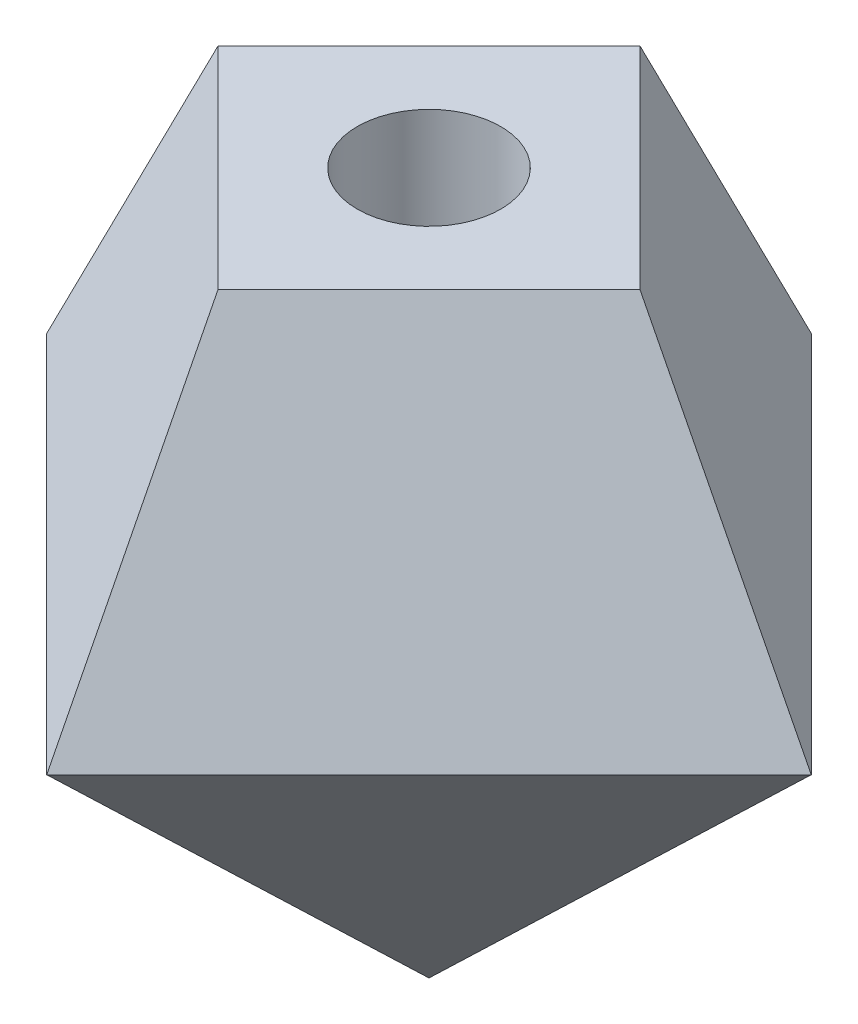
ISO-10303-21;
HEADER;
FILE_DESCRIPTION(('STEP AP214'),'2;1');
FILE_NAME('part.step','',(''),(''),'','','');
FILE_SCHEMA(('AUTOMOTIVE_DESIGN { 1 0 10303 214 1 1 1 1 }'));
ENDSEC;
DATA;
#1=APPLICATION_CONTEXT('core data for automotive mechanical design processes');
#2=APPLICATION_PROTOCOL_DEFINITION('international standard','automotive_design',2000,#1);
#3=PRODUCT_CONTEXT('',#1,'mechanical');
#4=PRODUCT('Part','Part','',(#3));
#5=PRODUCT_RELATED_PRODUCT_CATEGORY('part','',(#4));
#6=PRODUCT_DEFINITION_FORMATION('','',#4);
#7=PRODUCT_DEFINITION_CONTEXT('part definition',#1,'design');
#8=PRODUCT_DEFINITION('design','',#6,#7);
#9=PRODUCT_DEFINITION_SHAPE('','',#8);
#10=(LENGTH_UNIT() NAMED_UNIT(*) SI_UNIT(.MILLI.,.METRE.));
#11=(NAMED_UNIT(*) PLANE_ANGLE_UNIT() SI_UNIT($,.RADIAN.));
#12=(NAMED_UNIT(*) SI_UNIT($,.STERADIAN.) SOLID_ANGLE_UNIT());
#13=UNCERTAINTY_MEASURE_WITH_UNIT(LENGTH_MEASURE(1.E-05),#10,'distance_accuracy_value','');
#14=(GEOMETRIC_REPRESENTATION_CONTEXT(3) GLOBAL_UNCERTAINTY_ASSIGNED_CONTEXT((#13)) GLOBAL_UNIT_ASSIGNED_CONTEXT((#10,
#11,#12)) REPRESENTATION_CONTEXT('',''));
#15=CARTESIAN_POINT('',(0.,0.,0.));
#16=DIRECTION('',(0.,0.,1.));
#17=DIRECTION('',(1.,0.,0.));
#18=AXIS2_PLACEMENT_3D('',#15,#16,#17);
#19=CARTESIAN_POINT('',(90.2756165830993,49.5184628230477,25.4));
#20=DIRECTION('',(0.,-1.,0.));
#21=DIRECTION('',(0.,0.,-1.));
#22=AXIS2_PLACEMENT_3D('',#19,#20,#21);
#23=PLANE('',#22);
#24=CARTESIAN_POINT('',(90.2756165830993,49.5184628230477,0.));
#25=DIRECTION('',(0.,1.,0.));
#26=DIRECTION('',(0.,0.,1.));
#27=AXIS2_PLACEMENT_3D('',#24,#25,#26);
#28=CIRCLE('',#27,4.7625);
#29=CARTESIAN_POINT('',(90.2756165830993,49.5184628230477,4.7625));
#30=VERTEX_POINT('',#29);
#31=EDGE_CURVE('E149',#30,#30,#28,.T.);
#32=ORIENTED_EDGE('',*,*,#31,.F.);
#33=EDGE_LOOP('',(#32));
#34=FACE_BOUND('',#33,.T.);
#35=DIRECTION('',(-0.707106781186545,0.,0.70710678118655));
#36=VECTOR('',#35,1.);
#37=CARTESIAN_POINT('',(84.5865105530895,49.5184628230477,19.7108939699902));
#38=LINE('',#37,#36);
#39=CARTESIAN_POINT('',(104.29740452308,49.5184628230476,0.));
#40=VERTEX_POINT('',#39);
#41=CARTESIAN_POINT('',(90.2756165830994,49.5184628230477,14.0217879399803));
#42=VERTEX_POINT('',#41);
#43=EDGE_CURVE('E47',#40,#42,#38,.T.);
#44=ORIENTED_EDGE('',*,*,#43,.F.);
#45=DIRECTION('',(0.707106781186548,0.,0.707106781186547));
#46=VECTOR('',#45,1.);
#47=CARTESIAN_POINT('',(109.986510553089,49.5184628230477,5.68910603000988));
#48=LINE('',#47,#46);
#49=CARTESIAN_POINT('',(90.2756165830993,49.5184628230477,-14.0217879399803));
#50=VERTEX_POINT('',#49);
#51=EDGE_CURVE('E55',#50,#40,#48,.T.);
#52=ORIENTED_EDGE('',*,*,#51,.F.);
#53=DIRECTION('',(0.70710678118654,0.,-0.707106781186555));
#54=VECTOR('',#53,1.);
#55=CARTESIAN_POINT('',(70.5647226131092,49.5184628230477,5.68910603001023));
#56=LINE('',#55,#54);
#57=CARTESIAN_POINT('',(76.2538286431193,49.5184628230477,0.));
#58=VERTEX_POINT('',#57);
#59=EDGE_CURVE('E115',#58,#50,#56,.T.);
#60=ORIENTED_EDGE('',*,*,#59,.F.);
#61=DIRECTION('',(-0.707106781186548,0.,-0.707106781186547));
#62=VECTOR('',#61,1.);
#63=CARTESIAN_POINT('',(95.9647226131092,49.5184628230477,19.7108939699901));
#64=LINE('',#63,#62);
#65=EDGE_CURVE('E129',#42,#58,#64,.T.);
#66=ORIENTED_EDGE('',*,*,#65,.F.);
#67=EDGE_LOOP('',(#44,#52,#60,#66));
#68=FACE_BOUND('',#67,.T.);
#69=ADVANCED_FACE('F33',(#34,#68),#23,.F.);
#70=CARTESIAN_POINT('',(22.5023699159939,-11.5202131274325,-22.5023699159939));
#71=DIRECTION('',(-0.664881494830121,0.340389770211925,0.664881494830121));
#72=DIRECTION('',(0.707106781186548,0.,0.707106781186547));
#73=AXIS2_PLACEMENT_3D('',#70,#71,#72);
#74=PLANE('',#73);
#75=DIRECTION('',(0.707106781186548,0.,0.707106781186547));
#76=VECTOR('',#75,1.);
#77=CARTESIAN_POINT('',(77.5756165830994,27.2934628230477,12.7));
#78=LINE('',#77,#76);
#79=CARTESIAN_POINT('',(64.8756165830994,27.2934628230477,0.));
#80=VERTEX_POINT('',#79);
#81=CARTESIAN_POINT('',(90.2756165830994,27.2934628230477,25.4));
#82=VERTEX_POINT('',#81);
#83=EDGE_CURVE('E40',#80,#82,#78,.T.);
#84=ORIENTED_EDGE('',*,*,#83,.T.);
#85=DIRECTION('',(0.,0.890129875554102,-0.455706928459552));
#86=VECTOR('',#85,1.);
#87=CARTESIAN_POINT('',(90.2756165830993,27.2934628230477,25.4));
#88=LINE('',#87,#86);
#89=EDGE_CURVE('E132',#82,#42,#88,.T.);
#90=ORIENTED_EDGE('',*,*,#89,.T.);
#91=ORIENTED_EDGE('',*,*,#65,.T.);
#92=DIRECTION('',(-0.455706928459552,-0.890129875554102,0.));
#93=VECTOR('',#92,1.);
#94=CARTESIAN_POINT('',(76.2538286431191,49.5184628230477,0.));
#95=LINE('',#94,#93);
#96=EDGE_CURVE('E11',#58,#80,#95,.T.);
#97=ORIENTED_EDGE('',*,*,#96,.T.);
#98=EDGE_LOOP('',(#84,#90,#91,#97));
#99=FACE_BOUND('',#98,.T.);
#100=ADVANCED_FACE('F134',(#99),#74,.T.);
#101=CARTESIAN_POINT('',(67.7732466671056,-11.5202131274325,67.7732466671055));
#102=DIRECTION('',(0.664881494830124,0.340389770211925,0.664881494830119));
#103=DIRECTION('',(0.707106781186545,0.,-0.70710678118655));
#104=AXIS2_PLACEMENT_3D('',#101,#102,#103);
#105=PLANE('',#104);
#106=DIRECTION('',(0.707106781186545,0.,-0.70710678118655));
#107=VECTOR('',#106,1.);
#108=CARTESIAN_POINT('',(77.5756165830995,27.2934628230477,38.1));
#109=LINE('',#108,#107);
#110=CARTESIAN_POINT('',(115.675616583099,27.2934628230476,0.));
#111=VERTEX_POINT('',#110);
#112=EDGE_CURVE('E84',#82,#111,#109,.T.);
#113=ORIENTED_EDGE('',*,*,#112,.T.);
#114=DIRECTION('',(-0.455706928459552,0.890129875554102,0.));
#115=VECTOR('',#114,1.);
#116=CARTESIAN_POINT('',(121.472104211872,15.9712149276919,0.));
#117=LINE('',#116,#115);
#118=EDGE_CURVE('E108',#111,#40,#117,.T.);
#119=ORIENTED_EDGE('',*,*,#118,.T.);
#120=ORIENTED_EDGE('',*,*,#43,.T.);
#121=ORIENTED_EDGE('',*,*,#89,.F.);
#122=EDGE_LOOP('',(#113,#119,#120,#121));
#123=FACE_BOUND('',#122,.T.);
#124=ADVANCED_FACE('F146',(#123),#105,.T.);
#125=CARTESIAN_POINT('',(158.048863250205,-11.5202131274325,22.5023699159939));
#126=DIRECTION('',(0.664881494830121,0.340389770211925,-0.664881494830121));
#127=DIRECTION('',(-0.707106781186548,0.,-0.707106781186547));
#128=AXIS2_PLACEMENT_3D('',#125,#126,#127);
#129=PLANE('',#128);
#130=DIRECTION('',(-0.707106781186548,0.,-0.707106781186547));
#131=VECTOR('',#130,1.);
#132=CARTESIAN_POINT('',(102.975616583099,27.2934628230477,-12.7));
#133=LINE('',#132,#131);
#134=CARTESIAN_POINT('',(90.2756165830994,27.2934628230477,-25.4));
#135=VERTEX_POINT('',#134);
#136=EDGE_CURVE('E96',#111,#135,#133,.T.);
#137=ORIENTED_EDGE('',*,*,#136,.T.);
#138=DIRECTION('',(0.,0.890129875554101,0.455706928459554));
#139=VECTOR('',#138,1.);
#140=CARTESIAN_POINT('',(90.2756165830992,15.9712149276924,-31.1964876287725));
#141=LINE('',#140,#139);
#142=EDGE_CURVE('E106',#135,#50,#141,.T.);
#143=ORIENTED_EDGE('',*,*,#142,.T.);
#144=ORIENTED_EDGE('',*,*,#51,.T.);
#145=ORIENTED_EDGE('',*,*,#118,.F.);
#146=EDGE_LOOP('',(#137,#143,#144,#145));
#147=FACE_BOUND('',#146,.T.);
#148=ADVANCED_FACE('F176',(#147),#129,.T.);
#149=CARTESIAN_POINT('',(112.777986499093,-11.5202131274325,-67.7732466671057));
#150=DIRECTION('',(-0.664881494830128,0.340389770211925,-0.664881494830114));
#151=DIRECTION('',(-0.70710678118654,0.,0.707106781186555));
#152=AXIS2_PLACEMENT_3D('',#149,#150,#151);
#153=PLANE('',#152);
#154=DIRECTION('',(-0.70710678118654,0.,0.707106781186555));
#155=VECTOR('',#154,1.);
#156=CARTESIAN_POINT('',(52.1756165830995,27.2934628230477,12.7000000000004));
#157=LINE('',#156,#155);
#158=EDGE_CURVE('E102',#135,#80,#157,.T.);
#159=ORIENTED_EDGE('',*,*,#158,.T.);
#160=ORIENTED_EDGE('',*,*,#96,.F.);
#161=ORIENTED_EDGE('',*,*,#59,.T.);
#162=ORIENTED_EDGE('',*,*,#142,.F.);
#163=EDGE_LOOP('',(#159,#160,#161,#162));
#164=FACE_BOUND('',#163,.T.);
#165=ADVANCED_FACE('F138',(#164),#153,.T.);
#166=CARTESIAN_POINT('',(30.2501654762339,31.4957199697212,-30.250165476234));
#167=DIRECTION('',(-0.569429025934608,-0.592875340055837,0.56942902593461));
#168=DIRECTION('',(0.,-0.692701911407947,-0.721224002603752));
#169=AXIS2_PLACEMENT_3D('',#166,#167,#168);
#170=PLANE('',#169);
#171=DIRECTION('',(0.,0.692701911407947,0.721224002603752));
#172=VECTOR('',#171,1.);
#173=CARTESIAN_POINT('',(90.2756165830994,15.5876196111499,13.2121671730671));
#174=LINE('',#173,#172);
#175=CARTESIAN_POINT('',(90.2756165830994,2.89795118416439,0.));
#176=VERTEX_POINT('',#175);
#177=EDGE_CURVE('E79',#176,#82,#174,.T.);
#178=ORIENTED_EDGE('',*,*,#177,.T.);
#179=ORIENTED_EDGE('',*,*,#83,.F.);
#180=DIRECTION('',(0.721224002603753,-0.692701911407946,0.));
#181=VECTOR('',#180,1.);
#182=CARTESIAN_POINT('',(64.8756165830994,27.2934628230477,0.));
#183=LINE('',#182,#181);
#184=EDGE_CURVE('E88',#80,#176,#183,.T.);
#185=ORIENTED_EDGE('',*,*,#184,.T.);
#186=EDGE_LOOP('',(#178,#179,#185));
#187=FACE_BOUND('',#186,.T.);
#188=ADVANCED_FACE('F104',(#187),#170,.T.);
#189=CARTESIAN_POINT('',(120.525782059334,31.4957199697212,-60.0254511068654));
#190=DIRECTION('',(-0.569429025934608,-0.592875340055837,-0.56942902593461));
#191=DIRECTION('',(0.721224002603752,-0.692701911407947,0.));
#192=AXIS2_PLACEMENT_3D('',#189,#190,#191);
#193=PLANE('',#192);
#194=ORIENTED_EDGE('',*,*,#184,.F.);
#195=ORIENTED_EDGE('',*,*,#158,.F.);
#196=DIRECTION('',(0.,-0.692701911407947,0.721224002603752));
#197=VECTOR('',#196,1.);
#198=CARTESIAN_POINT('',(90.2756165830994,46.6084983065265,-45.5103345788576));
#199=LINE('',#198,#197);
#200=EDGE_CURVE('E89',#135,#176,#199,.T.);
#201=ORIENTED_EDGE('',*,*,#200,.T.);
#202=EDGE_LOOP('',(#194,#195,#201));
#203=FACE_BOUND('',#202,.T.);
#204=ADVANCED_FACE('F100',(#203),#193,.T.);
#205=CARTESIAN_POINT('',(60.0254511068648,31.4957199697212,60.0254511068652));
#206=DIRECTION('',(0.569429025934604,-0.592875340055837,0.569429025934614));
#207=DIRECTION('',(-0.721224002603752,-0.692701911407947,0.));
#208=AXIS2_PLACEMENT_3D('',#205,#206,#207);
#209=PLANE('',#208);
#210=ORIENTED_EDGE('',*,*,#112,.F.);
#211=ORIENTED_EDGE('',*,*,#177,.F.);
#212=DIRECTION('',(-0.721224002603754,-0.692701911407945,0.));
#213=VECTOR('',#212,1.);
#214=CARTESIAN_POINT('',(135.785951161957,46.6084983065265,1.70002900645727E-13));
#215=LINE('',#214,#213);
#216=EDGE_CURVE('E82',#111,#176,#215,.T.);
#217=ORIENTED_EDGE('',*,*,#216,.F.);
#218=EDGE_LOOP('',(#210,#211,#217));
#219=FACE_BOUND('',#218,.T.);
#220=ADVANCED_FACE('F81',(#219),#209,.T.);
#221=CARTESIAN_POINT('',(150.301067689965,31.4957199697212,30.250165476234));
#222=DIRECTION('',(0.569429025934608,-0.592875340055837,-0.56942902593461));
#223=DIRECTION('',(0.,-0.692701911407947,0.721224002603752));
#224=AXIS2_PLACEMENT_3D('',#221,#222,#223);
#225=PLANE('',#224);
#226=ORIENTED_EDGE('',*,*,#136,.F.);
#227=ORIENTED_EDGE('',*,*,#216,.T.);
#228=ORIENTED_EDGE('',*,*,#200,.F.);
#229=EDGE_LOOP('',(#226,#227,#228));
#230=FACE_BOUND('',#229,.T.);
#231=ADVANCED_FACE('F94',(#230),#225,.T.);
#232=CARTESIAN_POINT('',(90.2756165830993,24.1184628230477,0.));
#233=DIRECTION('',(0.,1.,0.));
#234=DIRECTION('',(0.,0.,1.));
#235=AXIS2_PLACEMENT_3D('',#232,#233,#234);
#236=CYLINDRICAL_SURFACE('',#235,4.7625);
#237=CARTESIAN_POINT('',(90.2756165830993,24.1184628230477,0.));
#238=DIRECTION('',(0.,1.,0.));
#239=DIRECTION('',(0.,0.,1.));
#240=AXIS2_PLACEMENT_3D('',#237,#238,#239);
#241=CIRCLE('',#240,4.7625);
#242=CARTESIAN_POINT('',(90.2756165830993,24.1184628230477,4.7625));
#243=VERTEX_POINT('',#242);
#244=EDGE_CURVE('E97',#243,#243,#241,.T.);
#245=ORIENTED_EDGE('',*,*,#244,.F.);
#246=EDGE_LOOP('',(#245));
#247=FACE_BOUND('',#246,.T.);
#248=ORIENTED_EDGE('',*,*,#31,.T.);
#249=EDGE_LOOP('',(#248));
#250=FACE_BOUND('',#249,.T.);
#251=ADVANCED_FACE('F158',(#247,#250),#236,.F.);
#252=CARTESIAN_POINT('',(90.2756165830993,24.1184628230477,0.));
#253=DIRECTION('',(0.,1.,0.));
#254=DIRECTION('',(0.,0.,1.));
#255=AXIS2_PLACEMENT_3D('',#252,#253,#254);
#256=PLANE('',#255);
#257=ORIENTED_EDGE('',*,*,#244,.T.);
#258=EDGE_LOOP('',(#257));
#259=FACE_BOUND('',#258,.T.);
#260=ADVANCED_FACE('F156',(#259),#256,.T.);
#261=CLOSED_SHELL('',(#69,#100,#124,#148,#165,#188,#204,#220,#231,#251,#260));
#262=MANIFOLD_SOLID_BREP('B2',#261);
#263=ADVANCED_BREP_SHAPE_REPRESENTATION('',(#18,#262),#14);
#264=SHAPE_DEFINITION_REPRESENTATION(#9,#263);
ENDSEC;
END-ISO-10303-21;
